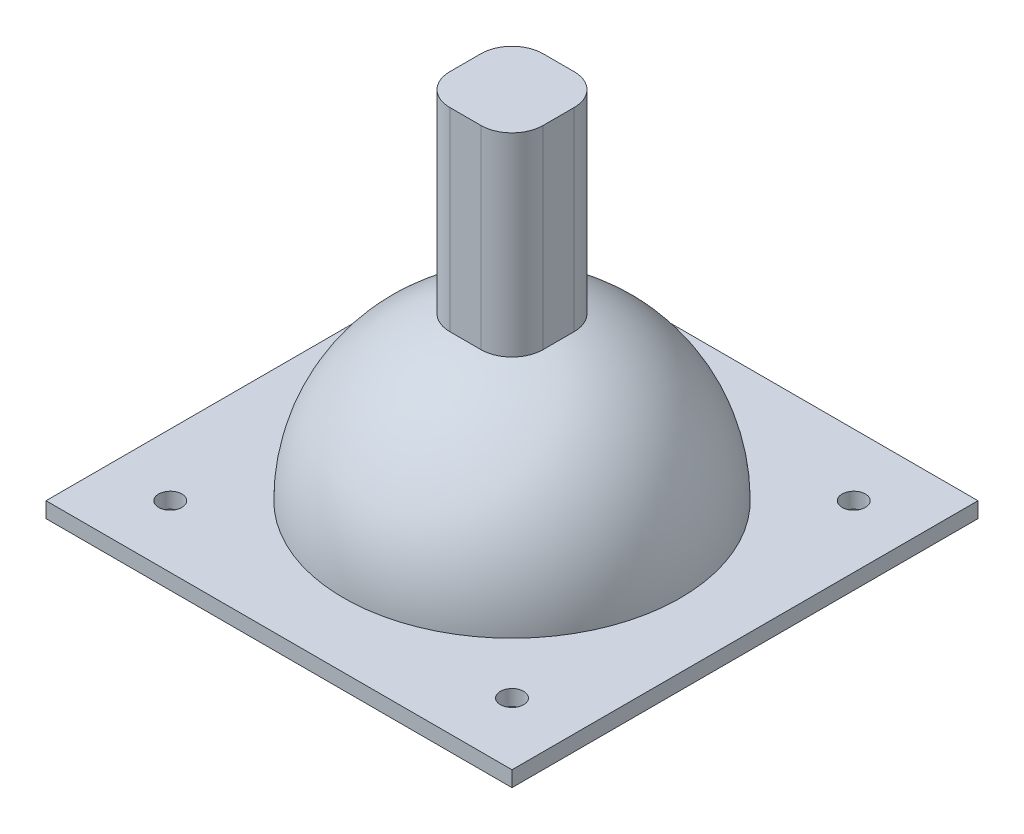
ISO-10303-21;
HEADER;
FILE_DESCRIPTION(('STEP AP214'),'2;1');
FILE_NAME('part.step','',(''),(''),'','','');
FILE_SCHEMA(('AUTOMOTIVE_DESIGN { 1 0 10303 214 1 1 1 1 }'));
ENDSEC;
DATA;
#1=APPLICATION_CONTEXT('core data for automotive mechanical design processes');
#2=APPLICATION_PROTOCOL_DEFINITION('international standard','automotive_design',2000,#1);
#3=PRODUCT_CONTEXT('',#1,'mechanical');
#4=PRODUCT('Part','Part','',(#3));
#5=PRODUCT_RELATED_PRODUCT_CATEGORY('part','',(#4));
#6=PRODUCT_DEFINITION_FORMATION('','',#4);
#7=PRODUCT_DEFINITION_CONTEXT('part definition',#1,'design');
#8=PRODUCT_DEFINITION('design','',#6,#7);
#9=PRODUCT_DEFINITION_SHAPE('','',#8);
#10=(LENGTH_UNIT() NAMED_UNIT(*) SI_UNIT(.MILLI.,.METRE.));
#11=(NAMED_UNIT(*) PLANE_ANGLE_UNIT() SI_UNIT($,.RADIAN.));
#12=(NAMED_UNIT(*) SI_UNIT($,.STERADIAN.) SOLID_ANGLE_UNIT());
#13=UNCERTAINTY_MEASURE_WITH_UNIT(LENGTH_MEASURE(1.E-05),#10,'distance_accuracy_value','');
#14=(GEOMETRIC_REPRESENTATION_CONTEXT(3) GLOBAL_UNCERTAINTY_ASSIGNED_CONTEXT((#13)) GLOBAL_UNIT_ASSIGNED_CONTEXT((#10,
#11,#12)) REPRESENTATION_CONTEXT('',''));
#15=CARTESIAN_POINT('',(0.,0.,0.));
#16=DIRECTION('',(0.,0.,1.));
#17=DIRECTION('',(1.,0.,0.));
#18=AXIS2_PLACEMENT_3D('',#15,#16,#17);
#19=CARTESIAN_POINT('',(0.,-26.4719078530888,0.));
#20=DIRECTION('',(0.,-1.,0.));
#21=DIRECTION('',(0.,0.,-1.));
#22=AXIS2_PLACEMENT_3D('',#19,#20,#21);
#23=PLANE('',#22);
#24=CARTESIAN_POINT('',(0.,-26.4719078530888,0.));
#25=DIRECTION('',(0.,-1.,0.));
#26=DIRECTION('',(0.,0.,-1.));
#27=AXIS2_PLACEMENT_3D('',#24,#25,#26);
#28=CIRCLE('',#27,24.892);
#29=CARTESIAN_POINT('',(0.,-26.4719078530888,-24.892));
#30=VERTEX_POINT('',#29);
#31=EDGE_CURVE('E336',#30,#30,#28,.F.);
#32=ORIENTED_EDGE('',*,*,#31,.F.);
#33=EDGE_LOOP('',(#32));
#34=FACE_BOUND('',#33,.T.);
#35=CARTESIAN_POINT('',(0.,-26.4719078530888,0.));
#36=DIRECTION('',(0.,1.,0.));
#37=DIRECTION('',(0.,0.,1.));
#38=AXIS2_PLACEMENT_3D('',#35,#36,#37);
#39=CIRCLE('',#38,25.0068020899419);
#40=CARTESIAN_POINT('',(0.,-26.4719078530888,25.0068020899419));
#41=VERTEX_POINT('',#40);
#42=EDGE_CURVE('E165',#41,#41,#39,.T.);
#43=ORIENTED_EDGE('',*,*,#42,.T.);
#44=EDGE_LOOP('',(#43));
#45=FACE_BOUND('',#44,.T.);
#46=ADVANCED_FACE('F33',(#34,#45),#23,.F.);
#47=CARTESIAN_POINT('',(0.,-26.4719078530888,0.));
#48=DIRECTION('',(0.,1.,0.));
#49=DIRECTION('',(0.,0.,1.));
#50=AXIS2_PLACEMENT_3D('',#47,#48,#49);
#51=SPHERICAL_SURFACE('',#50,25.0068020899419);
#52=ORIENTED_EDGE('',*,*,#42,.F.);
#53=EDGE_LOOP('',(#52));
#54=FACE_BOUND('',#53,.T.);
#55=ADVANCED_FACE('F292',(#54),#51,.F.);
#56=CARTESIAN_POINT('',(0.,43.9333001360933,0.));
#57=DIRECTION('',(0.,-1.,0.));
#58=DIRECTION('',(0.,0.,-1.));
#59=AXIS2_PLACEMENT_3D('',#56,#57,#58);
#60=CYLINDRICAL_SURFACE('',#59,24.892);
#61=ORIENTED_EDGE('',*,*,#31,.T.);
#62=EDGE_LOOP('',(#61));
#63=FACE_BOUND('',#62,.T.);
#64=CARTESIAN_POINT('',(0.,-29.0119078530888,0.));
#65=DIRECTION('',(0.,-1.,0.));
#66=DIRECTION('',(0.,0.,-1.));
#67=AXIS2_PLACEMENT_3D('',#64,#65,#66);
#68=CIRCLE('',#67,24.892);
#69=CARTESIAN_POINT('',(0.,-29.0119078530888,-24.892));
#70=VERTEX_POINT('',#69);
#71=EDGE_CURVE('E341',#70,#70,#68,.T.);
#72=ORIENTED_EDGE('',*,*,#71,.T.);
#73=EDGE_LOOP('',(#72));
#74=FACE_BOUND('',#73,.T.);
#75=ADVANCED_FACE('F299',(#63,#74),#60,.F.);
#76=CARTESIAN_POINT('',(0.,0.,0.));
#77=DIRECTION('',(0.,1.,0.));
#78=DIRECTION('',(0.,0.,1.));
#79=AXIS2_PLACEMENT_3D('',#76,#77,#78);
#80=PLANE('',#79);
#81=CARTESIAN_POINT('',(0.,0.,0.));
#82=DIRECTION('',(0.,1.,0.));
#83=DIRECTION('',(0.,0.,1.));
#84=AXIS2_PLACEMENT_3D('',#81,#82,#83);
#85=CIRCLE('',#84,7.62);
#86=CARTESIAN_POINT('',(0.,0.,7.62));
#87=VERTEX_POINT('',#86);
#88=CARTESIAN_POINT('',(-7.62,0.,0.));
#89=VERTEX_POINT('',#88);
#90=EDGE_CURVE('E11',#87,#89,#85,.F.);
#91=ORIENTED_EDGE('',*,*,#90,.F.);
#92=DIRECTION('',(1.,0.,0.));
#93=VECTOR('',#92,1.);
#94=CARTESIAN_POINT('',(7.62,0.,7.62));
#95=LINE('',#94,#93);
#96=CARTESIAN_POINT('',(-2.53999999999999,0.,7.62));
#97=VERTEX_POINT('',#96);
#98=EDGE_CURVE('E192',#97,#87,#95,.T.);
#99=ORIENTED_EDGE('',*,*,#98,.F.);
#100=CARTESIAN_POINT('',(-2.54,0.,2.54));
#101=DIRECTION('',(0.,1.,0.));
#102=DIRECTION('',(0.,0.,1.));
#103=AXIS2_PLACEMENT_3D('',#100,#101,#102);
#104=CIRCLE('',#103,5.08);
#105=CARTESIAN_POINT('',(-7.62,0.,2.54));
#106=VERTEX_POINT('',#105);
#107=EDGE_CURVE('E211',#97,#106,#104,.F.);
#108=ORIENTED_EDGE('',*,*,#107,.T.);
#109=DIRECTION('',(0.,0.,1.));
#110=VECTOR('',#109,1.);
#111=CARTESIAN_POINT('',(-7.62,0.,7.62));
#112=LINE('',#111,#110);
#113=EDGE_CURVE('E173',#89,#106,#112,.T.);
#114=ORIENTED_EDGE('',*,*,#113,.F.);
#115=EDGE_LOOP('',(#91,#99,#108,#114));
#116=FACE_BOUND('',#115,.T.);
#117=ADVANCED_FACE('F250',(#116),#80,.F.);
#118=CARTESIAN_POINT('',(0.,0.,-7.62));
#119=VERTEX_POINT('',#118);
#120=EDGE_CURVE('E42',#89,#119,#85,.F.);
#121=ORIENTED_EDGE('',*,*,#120,.F.);
#122=CARTESIAN_POINT('',(-7.62,0.,-2.53999999999999));
#123=VERTEX_POINT('',#122);
#124=EDGE_CURVE('E188',#123,#89,#112,.T.);
#125=ORIENTED_EDGE('',*,*,#124,.F.);
#126=CARTESIAN_POINT('',(-2.54,0.,-2.54));
#127=DIRECTION('',(0.,1.,0.));
#128=DIRECTION('',(0.,0.,1.));
#129=AXIS2_PLACEMENT_3D('',#126,#127,#128);
#130=CIRCLE('',#129,5.08);
#131=CARTESIAN_POINT('',(-2.54,0.,-7.62));
#132=VERTEX_POINT('',#131);
#133=EDGE_CURVE('E214',#123,#132,#130,.F.);
#134=ORIENTED_EDGE('',*,*,#133,.T.);
#135=DIRECTION('',(-1.,0.,0.));
#136=VECTOR('',#135,1.);
#137=CARTESIAN_POINT('',(7.62,0.,-7.62));
#138=LINE('',#137,#136);
#139=EDGE_CURVE('E198',#119,#132,#138,.T.);
#140=ORIENTED_EDGE('',*,*,#139,.F.);
#141=EDGE_LOOP('',(#121,#125,#134,#140));
#142=FACE_BOUND('',#141,.T.);
#143=ADVANCED_FACE('F248',(#142),#80,.F.);
#144=CARTESIAN_POINT('',(7.62,0.,0.));
#145=VERTEX_POINT('',#144);
#146=EDGE_CURVE('E55',#119,#145,#85,.F.);
#147=ORIENTED_EDGE('',*,*,#146,.F.);
#148=CARTESIAN_POINT('',(2.54,0.,-7.62));
#149=VERTEX_POINT('',#148);
#150=EDGE_CURVE('E178',#149,#119,#138,.T.);
#151=ORIENTED_EDGE('',*,*,#150,.F.);
#152=CARTESIAN_POINT('',(2.54,0.,-2.54));
#153=DIRECTION('',(0.,1.,0.));
#154=DIRECTION('',(0.,0.,1.));
#155=AXIS2_PLACEMENT_3D('',#152,#153,#154);
#156=CIRCLE('',#155,5.08);
#157=CARTESIAN_POINT('',(7.62,0.,-2.54));
#158=VERTEX_POINT('',#157);
#159=EDGE_CURVE('E205',#149,#158,#156,.F.);
#160=ORIENTED_EDGE('',*,*,#159,.T.);
#161=DIRECTION('',(0.,0.,-1.));
#162=VECTOR('',#161,1.);
#163=CARTESIAN_POINT('',(7.62,0.,7.62));
#164=LINE('',#163,#162);
#165=EDGE_CURVE('E194',#145,#158,#164,.T.);
#166=ORIENTED_EDGE('',*,*,#165,.F.);
#167=EDGE_LOOP('',(#147,#151,#160,#166));
#168=FACE_BOUND('',#167,.T.);
#169=ADVANCED_FACE('F270',(#168),#80,.F.);
#170=CARTESIAN_POINT('',(-7.62,31.75,7.62));
#171=DIRECTION('',(1.,0.,0.));
#172=DIRECTION('',(0.,0.,-1.));
#173=AXIS2_PLACEMENT_3D('',#170,#171,#172);
#174=PLANE('',#173);
#175=DIRECTION('',(0.,0.,1.));
#176=VECTOR('',#175,1.);
#177=CARTESIAN_POINT('',(-7.62,31.75,7.62));
#178=LINE('',#177,#176);
#179=CARTESIAN_POINT('',(-7.62,31.75,-2.53999999999999));
#180=VERTEX_POINT('',#179);
#181=CARTESIAN_POINT('',(-7.62,31.75,2.54));
#182=VERTEX_POINT('',#181);
#183=EDGE_CURVE('E174',#180,#182,#178,.T.);
#184=ORIENTED_EDGE('',*,*,#183,.F.);
#185=DIRECTION('',(0.,-1.,0.));
#186=VECTOR('',#185,1.);
#187=CARTESIAN_POINT('',(-7.62,31.75,-2.54));
#188=LINE('',#187,#186);
#189=EDGE_CURVE('E202',#180,#123,#188,.T.);
#190=ORIENTED_EDGE('',*,*,#189,.T.);
#191=ORIENTED_EDGE('',*,*,#124,.T.);
#192=ORIENTED_EDGE('',*,*,#113,.T.);
#193=DIRECTION('',(0.,-1.,0.));
#194=VECTOR('',#193,1.);
#195=CARTESIAN_POINT('',(-7.62,31.75,2.54));
#196=LINE('',#195,#194);
#197=EDGE_CURVE('E187',#106,#182,#196,.F.);
#198=ORIENTED_EDGE('',*,*,#197,.T.);
#199=EDGE_LOOP('',(#184,#190,#191,#192,#198));
#200=FACE_BOUND('',#199,.T.);
#201=ADVANCED_FACE('F255',(#200),#174,.F.);
#202=CARTESIAN_POINT('',(7.62,31.75,7.62));
#203=DIRECTION('',(0.,0.,-1.));
#204=DIRECTION('',(-1.,0.,0.));
#205=AXIS2_PLACEMENT_3D('',#202,#203,#204);
#206=PLANE('',#205);
#207=DIRECTION('',(1.,0.,0.));
#208=VECTOR('',#207,1.);
#209=CARTESIAN_POINT('',(7.62,31.75,7.62));
#210=LINE('',#209,#208);
#211=CARTESIAN_POINT('',(-2.53999999999999,31.75,7.62));
#212=VERTEX_POINT('',#211);
#213=CARTESIAN_POINT('',(2.54,31.75,7.62));
#214=VERTEX_POINT('',#213);
#215=EDGE_CURVE('E177',#212,#214,#210,.T.);
#216=ORIENTED_EDGE('',*,*,#215,.F.);
#217=DIRECTION('',(0.,-1.,0.));
#218=VECTOR('',#217,1.);
#219=CARTESIAN_POINT('',(-2.54,31.75,7.62));
#220=LINE('',#219,#218);
#221=EDGE_CURVE('E232',#212,#97,#220,.T.);
#222=ORIENTED_EDGE('',*,*,#221,.T.);
#223=ORIENTED_EDGE('',*,*,#98,.T.);
#224=CARTESIAN_POINT('',(2.54,0.,7.62));
#225=VERTEX_POINT('',#224);
#226=EDGE_CURVE('E191',#87,#225,#95,.T.);
#227=ORIENTED_EDGE('',*,*,#226,.T.);
#228=DIRECTION('',(0.,-1.,0.));
#229=VECTOR('',#228,1.);
#230=CARTESIAN_POINT('',(2.54,31.75,7.62));
#231=LINE('',#230,#229);
#232=EDGE_CURVE('E230',#225,#214,#231,.F.);
#233=ORIENTED_EDGE('',*,*,#232,.T.);
#234=EDGE_LOOP('',(#216,#222,#223,#227,#233));
#235=FACE_BOUND('',#234,.T.);
#236=ADVANCED_FACE('F279',(#235),#206,.F.);
#237=CARTESIAN_POINT('',(7.62,31.75,7.62));
#238=DIRECTION('',(-1.,0.,0.));
#239=DIRECTION('',(0.,0.,1.));
#240=AXIS2_PLACEMENT_3D('',#237,#238,#239);
#241=PLANE('',#240);
#242=DIRECTION('',(0.,0.,-1.));
#243=VECTOR('',#242,1.);
#244=CARTESIAN_POINT('',(7.62,31.75,7.62));
#245=LINE('',#244,#243);
#246=CARTESIAN_POINT('',(7.62,31.75,2.54));
#247=VERTEX_POINT('',#246);
#248=CARTESIAN_POINT('',(7.62,31.75,-2.54));
#249=VERTEX_POINT('',#248);
#250=EDGE_CURVE('E181',#247,#249,#245,.T.);
#251=ORIENTED_EDGE('',*,*,#250,.F.);
#252=DIRECTION('',(0.,-1.,0.));
#253=VECTOR('',#252,1.);
#254=CARTESIAN_POINT('',(7.62,31.75,2.54));
#255=LINE('',#254,#253);
#256=CARTESIAN_POINT('',(7.62,0.,2.54));
#257=VERTEX_POINT('',#256);
#258=EDGE_CURVE('E236',#247,#257,#255,.T.);
#259=ORIENTED_EDGE('',*,*,#258,.T.);
#260=EDGE_CURVE('E195',#257,#145,#164,.T.);
#261=ORIENTED_EDGE('',*,*,#260,.T.);
#262=ORIENTED_EDGE('',*,*,#165,.T.);
#263=DIRECTION('',(0.,-1.,0.));
#264=VECTOR('',#263,1.);
#265=CARTESIAN_POINT('',(7.62,31.75,-2.54));
#266=LINE('',#265,#264);
#267=EDGE_CURVE('E235',#158,#249,#266,.F.);
#268=ORIENTED_EDGE('',*,*,#267,.T.);
#269=EDGE_LOOP('',(#251,#259,#261,#262,#268));
#270=FACE_BOUND('',#269,.T.);
#271=ADVANCED_FACE('F271',(#270),#241,.F.);
#272=CARTESIAN_POINT('',(7.62,31.75,-7.62));
#273=DIRECTION('',(0.,0.,1.));
#274=DIRECTION('',(1.,0.,0.));
#275=AXIS2_PLACEMENT_3D('',#272,#273,#274);
#276=PLANE('',#275);
#277=ORIENTED_EDGE('',*,*,#150,.T.);
#278=ORIENTED_EDGE('',*,*,#139,.T.);
#279=DIRECTION('',(0.,-1.,0.));
#280=VECTOR('',#279,1.);
#281=CARTESIAN_POINT('',(-2.54,31.75,-7.62));
#282=LINE('',#281,#280);
#283=CARTESIAN_POINT('',(-2.54,31.75,-7.62));
#284=VERTEX_POINT('',#283);
#285=EDGE_CURVE('E220',#132,#284,#282,.F.);
#286=ORIENTED_EDGE('',*,*,#285,.T.);
#287=DIRECTION('',(-1.,0.,0.));
#288=VECTOR('',#287,1.);
#289=CARTESIAN_POINT('',(7.62,31.75,-7.62));
#290=LINE('',#289,#288);
#291=CARTESIAN_POINT('',(2.54,31.75,-7.62));
#292=VERTEX_POINT('',#291);
#293=EDGE_CURVE('E184',#292,#284,#290,.T.);
#294=ORIENTED_EDGE('',*,*,#293,.F.);
#295=DIRECTION('',(0.,-1.,0.));
#296=VECTOR('',#295,1.);
#297=CARTESIAN_POINT('',(2.54,31.75,-7.62));
#298=LINE('',#297,#296);
#299=EDGE_CURVE('E217',#292,#149,#298,.T.);
#300=ORIENTED_EDGE('',*,*,#299,.T.);
#301=EDGE_LOOP('',(#277,#278,#286,#294,#300));
#302=FACE_BOUND('',#301,.T.);
#303=ADVANCED_FACE('F263',(#302),#276,.F.);
#304=CARTESIAN_POINT('',(0.,31.75,0.));
#305=DIRECTION('',(0.,1.,0.));
#306=DIRECTION('',(0.,0.,1.));
#307=AXIS2_PLACEMENT_3D('',#304,#305,#306);
#308=PLANE('',#307);
#309=ORIENTED_EDGE('',*,*,#293,.T.);
#310=CARTESIAN_POINT('',(-2.54,31.75,-2.54));
#311=DIRECTION('',(0.,1.,0.));
#312=DIRECTION('',(0.,0.,1.));
#313=AXIS2_PLACEMENT_3D('',#310,#311,#312);
#314=CIRCLE('',#313,5.08);
#315=EDGE_CURVE('E228',#284,#180,#314,.T.);
#316=ORIENTED_EDGE('',*,*,#315,.T.);
#317=ORIENTED_EDGE('',*,*,#183,.T.);
#318=CARTESIAN_POINT('',(-2.54,31.75,2.54));
#319=DIRECTION('',(0.,1.,0.));
#320=DIRECTION('',(0.,0.,1.));
#321=AXIS2_PLACEMENT_3D('',#318,#319,#320);
#322=CIRCLE('',#321,5.08);
#323=EDGE_CURVE('E226',#182,#212,#322,.T.);
#324=ORIENTED_EDGE('',*,*,#323,.T.);
#325=ORIENTED_EDGE('',*,*,#215,.T.);
#326=CARTESIAN_POINT('',(2.54,31.75,2.54));
#327=DIRECTION('',(0.,1.,0.));
#328=DIRECTION('',(0.,0.,1.));
#329=AXIS2_PLACEMENT_3D('',#326,#327,#328);
#330=CIRCLE('',#329,5.08);
#331=EDGE_CURVE('E224',#214,#247,#330,.T.);
#332=ORIENTED_EDGE('',*,*,#331,.T.);
#333=ORIENTED_EDGE('',*,*,#250,.T.);
#334=CARTESIAN_POINT('',(2.54,31.75,-2.54));
#335=DIRECTION('',(0.,1.,0.));
#336=DIRECTION('',(0.,0.,1.));
#337=AXIS2_PLACEMENT_3D('',#334,#335,#336);
#338=CIRCLE('',#337,5.08);
#339=EDGE_CURVE('E222',#249,#292,#338,.T.);
#340=ORIENTED_EDGE('',*,*,#339,.T.);
#341=EDGE_LOOP('',(#309,#316,#317,#324,#325,#332,#333,#340));
#342=FACE_BOUND('',#341,.T.);
#343=ADVANCED_FACE('F266',(#342),#308,.T.);
#344=EDGE_CURVE('E37',#145,#87,#85,.F.);
#345=ORIENTED_EDGE('',*,*,#344,.F.);
#346=ORIENTED_EDGE('',*,*,#260,.F.);
#347=CARTESIAN_POINT('',(2.54,0.,2.54));
#348=DIRECTION('',(0.,1.,0.));
#349=DIRECTION('',(0.,0.,1.));
#350=AXIS2_PLACEMENT_3D('',#347,#348,#349);
#351=CIRCLE('',#350,5.08);
#352=EDGE_CURVE('E208',#257,#225,#351,.F.);
#353=ORIENTED_EDGE('',*,*,#352,.T.);
#354=ORIENTED_EDGE('',*,*,#226,.F.);
#355=EDGE_LOOP('',(#345,#346,#353,#354));
#356=FACE_BOUND('',#355,.T.);
#357=ADVANCED_FACE('F272',(#356),#80,.F.);
#358=CARTESIAN_POINT('',(-2.54,31.75,-2.54));
#359=DIRECTION('',(0.,-1.,0.));
#360=DIRECTION('',(0.,0.,-1.));
#361=AXIS2_PLACEMENT_3D('',#358,#359,#360);
#362=CYLINDRICAL_SURFACE('',#361,5.08);
#363=ORIENTED_EDGE('',*,*,#315,.F.);
#364=ORIENTED_EDGE('',*,*,#285,.F.);
#365=ORIENTED_EDGE('',*,*,#133,.F.);
#366=ORIENTED_EDGE('',*,*,#189,.F.);
#367=EDGE_LOOP('',(#363,#364,#365,#366));
#368=FACE_BOUND('',#367,.T.);
#369=ADVANCED_FACE('F259',(#368),#362,.T.);
#370=CARTESIAN_POINT('',(-2.54,31.75,2.54));
#371=DIRECTION('',(0.,-1.,0.));
#372=DIRECTION('',(0.,0.,-1.));
#373=AXIS2_PLACEMENT_3D('',#370,#371,#372);
#374=CYLINDRICAL_SURFACE('',#373,5.08);
#375=ORIENTED_EDGE('',*,*,#323,.F.);
#376=ORIENTED_EDGE('',*,*,#197,.F.);
#377=ORIENTED_EDGE('',*,*,#107,.F.);
#378=ORIENTED_EDGE('',*,*,#221,.F.);
#379=EDGE_LOOP('',(#375,#376,#377,#378));
#380=FACE_BOUND('',#379,.T.);
#381=ADVANCED_FACE('F283',(#380),#374,.T.);
#382=CARTESIAN_POINT('',(2.54,31.75,2.54));
#383=DIRECTION('',(0.,-1.,0.));
#384=DIRECTION('',(0.,0.,-1.));
#385=AXIS2_PLACEMENT_3D('',#382,#383,#384);
#386=CYLINDRICAL_SURFACE('',#385,5.08);
#387=ORIENTED_EDGE('',*,*,#331,.F.);
#388=ORIENTED_EDGE('',*,*,#232,.F.);
#389=ORIENTED_EDGE('',*,*,#352,.F.);
#390=ORIENTED_EDGE('',*,*,#258,.F.);
#391=EDGE_LOOP('',(#387,#388,#389,#390));
#392=FACE_BOUND('',#391,.T.);
#393=ADVANCED_FACE('F276',(#392),#386,.T.);
#394=CARTESIAN_POINT('',(2.54,31.75,-2.54));
#395=DIRECTION('',(0.,-1.,0.));
#396=DIRECTION('',(0.,0.,-1.));
#397=AXIS2_PLACEMENT_3D('',#394,#395,#396);
#398=CYLINDRICAL_SURFACE('',#397,5.08);
#399=ORIENTED_EDGE('',*,*,#339,.F.);
#400=ORIENTED_EDGE('',*,*,#267,.F.);
#401=ORIENTED_EDGE('',*,*,#159,.F.);
#402=ORIENTED_EDGE('',*,*,#299,.F.);
#403=EDGE_LOOP('',(#399,#400,#401,#402));
#404=FACE_BOUND('',#403,.T.);
#405=ADVANCED_FACE('F35',(#404),#398,.T.);
#406=CARTESIAN_POINT('',(0.,-26.4719078530888,0.));
#407=DIRECTION('',(0.,1.,0.));
#408=DIRECTION('',(0.,0.,-1.));
#409=AXIS2_PLACEMENT_3D('',#406,#407,#408);
#410=SPHERICAL_SURFACE('',#409,27.5468020899419);
#411=CARTESIAN_POINT('',(0.,-26.4719078530888,0.));
#412=DIRECTION('',(0.,-1.,0.));
#413=DIRECTION('',(0.,0.,-1.));
#414=AXIS2_PLACEMENT_3D('',#411,#412,#413);
#415=CIRCLE('',#414,27.5468020899419);
#416=CARTESIAN_POINT('',(0.,-26.4719078530888,-27.5468020899419));
#417=VERTEX_POINT('',#416);
#418=EDGE_CURVE('E162',#417,#417,#415,.T.);
#419=ORIENTED_EDGE('',*,*,#418,.F.);
#420=EDGE_LOOP('',(#419));
#421=FACE_BOUND('',#420,.T.);
#422=ORIENTED_EDGE('',*,*,#344,.T.);
#423=ORIENTED_EDGE('',*,*,#90,.T.);
#424=ORIENTED_EDGE('',*,*,#120,.T.);
#425=ORIENTED_EDGE('',*,*,#146,.T.);
#426=EDGE_LOOP('',(#422,#423,#424,#425));
#427=FACE_BOUND('',#426,.T.);
#428=ADVANCED_FACE('F243',(#421,#427),#410,.T.);
#429=CARTESIAN_POINT('',(-27.94,-26.4719078530888,27.94));
#430=DIRECTION('',(0.,1.,0.));
#431=DIRECTION('',(0.,0.,1.));
#432=AXIS2_PLACEMENT_3D('',#429,#430,#431);
#433=CIRCLE('',#432,1.905);
#434=CARTESIAN_POINT('',(-27.94,-26.4719078530888,29.845));
#435=VERTEX_POINT('',#434);
#436=EDGE_CURVE('E318',#435,#435,#433,.T.);
#437=ORIENTED_EDGE('',*,*,#436,.F.);
#438=EDGE_LOOP('',(#437));
#439=FACE_BOUND('',#438,.T.);
#440=CARTESIAN_POINT('',(27.94,-26.4719078530888,-27.94));
#441=DIRECTION('',(0.,1.,0.));
#442=DIRECTION('',(0.,0.,1.));
#443=AXIS2_PLACEMENT_3D('',#440,#441,#442);
#444=CIRCLE('',#443,1.905);
#445=CARTESIAN_POINT('',(27.94,-26.4719078530888,-26.035));
#446=VERTEX_POINT('',#445);
#447=EDGE_CURVE('E322',#446,#446,#444,.T.);
#448=ORIENTED_EDGE('',*,*,#447,.F.);
#449=EDGE_LOOP('',(#448));
#450=FACE_BOUND('',#449,.T.);
#451=CARTESIAN_POINT('',(27.94,-26.4719078530888,27.94));
#452=DIRECTION('',(0.,1.,0.));
#453=DIRECTION('',(0.,0.,1.));
#454=AXIS2_PLACEMENT_3D('',#451,#452,#453);
#455=CIRCLE('',#454,1.905);
#456=CARTESIAN_POINT('',(27.94,-26.4719078530888,29.845));
#457=VERTEX_POINT('',#456);
#458=EDGE_CURVE('E326',#457,#457,#455,.T.);
#459=ORIENTED_EDGE('',*,*,#458,.F.);
#460=EDGE_LOOP('',(#459));
#461=FACE_BOUND('',#460,.T.);
#462=CARTESIAN_POINT('',(-27.94,-26.4719078530888,-27.94));
#463=DIRECTION('',(0.,1.,0.));
#464=DIRECTION('',(0.,0.,1.));
#465=AXIS2_PLACEMENT_3D('',#462,#463,#464);
#466=CIRCLE('',#465,1.905);
#467=CARTESIAN_POINT('',(-27.94,-26.4719078530888,-26.035));
#468=VERTEX_POINT('',#467);
#469=EDGE_CURVE('E330',#468,#468,#466,.T.);
#470=ORIENTED_EDGE('',*,*,#469,.F.);
#471=EDGE_LOOP('',(#470));
#472=FACE_BOUND('',#471,.T.);
#473=DIRECTION('',(0.,0.,-1.));
#474=VECTOR('',#473,1.);
#475=CARTESIAN_POINT('',(-38.1,-26.4719078530888,-38.1));
#476=LINE('',#475,#474);
#477=CARTESIAN_POINT('',(-38.1,-26.4719078530888,38.1));
#478=VERTEX_POINT('',#477);
#479=CARTESIAN_POINT('',(-38.1,-26.4719078530888,-38.1));
#480=VERTEX_POINT('',#479);
#481=EDGE_CURVE('E161',#478,#480,#476,.T.);
#482=ORIENTED_EDGE('',*,*,#481,.F.);
#483=DIRECTION('',(-1.,0.,0.));
#484=VECTOR('',#483,1.);
#485=CARTESIAN_POINT('',(38.1,-26.4719078530888,38.1));
#486=LINE('',#485,#484);
#487=CARTESIAN_POINT('',(38.1,-26.4719078530888,38.1));
#488=VERTEX_POINT('',#487);
#489=EDGE_CURVE('E157',#488,#478,#486,.T.);
#490=ORIENTED_EDGE('',*,*,#489,.F.);
#491=DIRECTION('',(0.,0.,1.));
#492=VECTOR('',#491,1.);
#493=CARTESIAN_POINT('',(38.1,-26.4719078530888,-38.1));
#494=LINE('',#493,#492);
#495=CARTESIAN_POINT('',(38.1,-26.4719078530888,-38.1));
#496=VERTEX_POINT('',#495);
#497=EDGE_CURVE('E338',#496,#488,#494,.T.);
#498=ORIENTED_EDGE('',*,*,#497,.F.);
#499=DIRECTION('',(1.,0.,0.));
#500=VECTOR('',#499,1.);
#501=CARTESIAN_POINT('',(38.1,-26.4719078530888,-38.1));
#502=LINE('',#501,#500);
#503=EDGE_CURVE('E335',#480,#496,#502,.T.);
#504=ORIENTED_EDGE('',*,*,#503,.F.);
#505=EDGE_LOOP('',(#482,#490,#498,#504));
#506=FACE_BOUND('',#505,.T.);
#507=ORIENTED_EDGE('',*,*,#418,.T.);
#508=EDGE_LOOP('',(#507));
#509=FACE_BOUND('',#508,.T.);
#510=ADVANCED_FACE('F295',(#439,#450,#461,#472,#506,#509),#23,.F.);
#511=CARTESIAN_POINT('',(-38.1,-29.0119078530888,-38.1));
#512=DIRECTION('',(1.,0.,0.));
#513=DIRECTION('',(0.,0.,-1.));
#514=AXIS2_PLACEMENT_3D('',#511,#512,#513);
#515=PLANE('',#514);
#516=ORIENTED_EDGE('',*,*,#481,.T.);
#517=DIRECTION('',(0.,1.,0.));
#518=VECTOR('',#517,1.);
#519=CARTESIAN_POINT('',(-38.1,-29.0119078530888,-38.1));
#520=LINE('',#519,#518);
#521=CARTESIAN_POINT('',(-38.1,-29.0119078530888,-38.1));
#522=VERTEX_POINT('',#521);
#523=EDGE_CURVE('E141',#522,#480,#520,.T.);
#524=ORIENTED_EDGE('',*,*,#523,.F.);
#525=DIRECTION('',(0.,0.,-1.));
#526=VECTOR('',#525,1.);
#527=CARTESIAN_POINT('',(-38.1,-29.0119078530888,-38.1));
#528=LINE('',#527,#526);
#529=CARTESIAN_POINT('',(-38.1,-29.0119078530888,38.1));
#530=VERTEX_POINT('',#529);
#531=EDGE_CURVE('E148',#530,#522,#528,.T.);
#532=ORIENTED_EDGE('',*,*,#531,.F.);
#533=DIRECTION('',(0.,1.,0.));
#534=VECTOR('',#533,1.);
#535=CARTESIAN_POINT('',(-38.1,-29.0119078530888,38.1));
#536=LINE('',#535,#534);
#537=EDGE_CURVE('E348',#530,#478,#536,.T.);
#538=ORIENTED_EDGE('',*,*,#537,.T.);
#539=EDGE_LOOP('',(#516,#524,#532,#538));
#540=FACE_BOUND('',#539,.T.);
#541=ADVANCED_FACE('F159',(#540),#515,.F.);
#542=CARTESIAN_POINT('',(38.1,-29.0119078530888,-38.1));
#543=DIRECTION('',(0.,0.,1.));
#544=DIRECTION('',(1.,0.,0.));
#545=AXIS2_PLACEMENT_3D('',#542,#543,#544);
#546=PLANE('',#545);
#547=ORIENTED_EDGE('',*,*,#503,.T.);
#548=DIRECTION('',(0.,1.,0.));
#549=VECTOR('',#548,1.);
#550=CARTESIAN_POINT('',(38.1,-29.0119078530888,-38.1));
#551=LINE('',#550,#549);
#552=CARTESIAN_POINT('',(38.1,-29.0119078530888,-38.1));
#553=VERTEX_POINT('',#552);
#554=EDGE_CURVE('E144',#553,#496,#551,.T.);
#555=ORIENTED_EDGE('',*,*,#554,.F.);
#556=DIRECTION('',(1.,0.,0.));
#557=VECTOR('',#556,1.);
#558=CARTESIAN_POINT('',(38.1,-29.0119078530888,-38.1));
#559=LINE('',#558,#557);
#560=EDGE_CURVE('E137',#522,#553,#559,.T.);
#561=ORIENTED_EDGE('',*,*,#560,.F.);
#562=ORIENTED_EDGE('',*,*,#523,.T.);
#563=EDGE_LOOP('',(#547,#555,#561,#562));
#564=FACE_BOUND('',#563,.T.);
#565=ADVANCED_FACE('F139',(#564),#546,.F.);
#566=CARTESIAN_POINT('',(38.1,-29.0119078530888,-38.1));
#567=DIRECTION('',(-1.,0.,0.));
#568=DIRECTION('',(0.,0.,1.));
#569=AXIS2_PLACEMENT_3D('',#566,#567,#568);
#570=PLANE('',#569);
#571=ORIENTED_EDGE('',*,*,#497,.T.);
#572=DIRECTION('',(0.,1.,0.));
#573=VECTOR('',#572,1.);
#574=CARTESIAN_POINT('',(38.1,-29.0119078530888,38.1));
#575=LINE('',#574,#573);
#576=CARTESIAN_POINT('',(38.1,-29.0119078530888,38.1));
#577=VERTEX_POINT('',#576);
#578=EDGE_CURVE('E167',#577,#488,#575,.T.);
#579=ORIENTED_EDGE('',*,*,#578,.F.);
#580=DIRECTION('',(0.,0.,1.));
#581=VECTOR('',#580,1.);
#582=CARTESIAN_POINT('',(38.1,-29.0119078530888,-38.1));
#583=LINE('',#582,#581);
#584=EDGE_CURVE('E147',#553,#577,#583,.T.);
#585=ORIENTED_EDGE('',*,*,#584,.F.);
#586=ORIENTED_EDGE('',*,*,#554,.T.);
#587=EDGE_LOOP('',(#571,#579,#585,#586));
#588=FACE_BOUND('',#587,.T.);
#589=ADVANCED_FACE('F354',(#588),#570,.F.);
#590=CARTESIAN_POINT('',(38.1,-29.0119078530888,38.1));
#591=DIRECTION('',(0.,0.,-1.));
#592=DIRECTION('',(-1.,0.,0.));
#593=AXIS2_PLACEMENT_3D('',#590,#591,#592);
#594=PLANE('',#593);
#595=ORIENTED_EDGE('',*,*,#489,.T.);
#596=ORIENTED_EDGE('',*,*,#537,.F.);
#597=DIRECTION('',(-1.,0.,0.));
#598=VECTOR('',#597,1.);
#599=CARTESIAN_POINT('',(38.1,-29.0119078530888,38.1));
#600=LINE('',#599,#598);
#601=EDGE_CURVE('E153',#577,#530,#600,.T.);
#602=ORIENTED_EDGE('',*,*,#601,.F.);
#603=ORIENTED_EDGE('',*,*,#578,.T.);
#604=EDGE_LOOP('',(#595,#596,#602,#603));
#605=FACE_BOUND('',#604,.T.);
#606=ADVANCED_FACE('F352',(#605),#594,.F.);
#607=CARTESIAN_POINT('',(0.,-29.0119078530888,0.));
#608=DIRECTION('',(0.,-1.,0.));
#609=DIRECTION('',(0.,0.,-1.));
#610=AXIS2_PLACEMENT_3D('',#607,#608,#609);
#611=PLANE('',#610);
#612=CARTESIAN_POINT('',(-27.94,-29.0119078530888,27.94));
#613=DIRECTION('',(0.,1.,0.));
#614=DIRECTION('',(0.,0.,1.));
#615=AXIS2_PLACEMENT_3D('',#612,#613,#614);
#616=CIRCLE('',#615,1.905);
#617=CARTESIAN_POINT('',(-27.94,-29.0119078530888,29.845));
#618=VERTEX_POINT('',#617);
#619=EDGE_CURVE('E360',#618,#618,#616,.T.);
#620=ORIENTED_EDGE('',*,*,#619,.T.);
#621=EDGE_LOOP('',(#620));
#622=FACE_BOUND('',#621,.T.);
#623=CARTESIAN_POINT('',(27.94,-29.0119078530888,-27.94));
#624=DIRECTION('',(0.,1.,0.));
#625=DIRECTION('',(0.,0.,1.));
#626=AXIS2_PLACEMENT_3D('',#623,#624,#625);
#627=CIRCLE('',#626,1.905);
#628=CARTESIAN_POINT('',(27.94,-29.0119078530888,-26.035));
#629=VERTEX_POINT('',#628);
#630=EDGE_CURVE('E368',#629,#629,#627,.T.);
#631=ORIENTED_EDGE('',*,*,#630,.T.);
#632=EDGE_LOOP('',(#631));
#633=FACE_BOUND('',#632,.T.);
#634=CARTESIAN_POINT('',(27.94,-29.0119078530888,27.94));
#635=DIRECTION('',(0.,1.,0.));
#636=DIRECTION('',(0.,0.,1.));
#637=AXIS2_PLACEMENT_3D('',#634,#635,#636);
#638=CIRCLE('',#637,1.905);
#639=CARTESIAN_POINT('',(27.94,-29.0119078530888,29.845));
#640=VERTEX_POINT('',#639);
#641=EDGE_CURVE('E364',#640,#640,#638,.T.);
#642=ORIENTED_EDGE('',*,*,#641,.T.);
#643=EDGE_LOOP('',(#642));
#644=FACE_BOUND('',#643,.T.);
#645=CARTESIAN_POINT('',(-27.94,-29.0119078530888,-27.94));
#646=DIRECTION('',(0.,1.,0.));
#647=DIRECTION('',(0.,0.,1.));
#648=AXIS2_PLACEMENT_3D('',#645,#646,#647);
#649=CIRCLE('',#648,1.905);
#650=CARTESIAN_POINT('',(-27.94,-29.0119078530888,-26.035));
#651=VERTEX_POINT('',#650);
#652=EDGE_CURVE('E358',#651,#651,#649,.T.);
#653=ORIENTED_EDGE('',*,*,#652,.T.);
#654=EDGE_LOOP('',(#653));
#655=FACE_BOUND('',#654,.T.);
#656=ORIENTED_EDGE('',*,*,#71,.F.);
#657=EDGE_LOOP('',(#656));
#658=FACE_BOUND('',#657,.T.);
#659=ORIENTED_EDGE('',*,*,#531,.T.);
#660=ORIENTED_EDGE('',*,*,#560,.T.);
#661=ORIENTED_EDGE('',*,*,#584,.T.);
#662=ORIENTED_EDGE('',*,*,#601,.T.);
#663=EDGE_LOOP('',(#659,#660,#661,#662));
#664=FACE_BOUND('',#663,.T.);
#665=ADVANCED_FACE('F151',(#622,#633,#644,#655,#658,#664),#611,.T.);
#666=CARTESIAN_POINT('',(-27.94,-29.0119078530888,-27.94));
#667=DIRECTION('',(0.,1.,0.));
#668=DIRECTION('',(0.,0.,1.));
#669=AXIS2_PLACEMENT_3D('',#666,#667,#668);
#670=CYLINDRICAL_SURFACE('',#669,1.905);
#671=ORIENTED_EDGE('',*,*,#652,.F.);
#672=EDGE_LOOP('',(#671));
#673=FACE_BOUND('',#672,.T.);
#674=ORIENTED_EDGE('',*,*,#469,.T.);
#675=EDGE_LOOP('',(#674));
#676=FACE_BOUND('',#675,.T.);
#677=ADVANCED_FACE('F391',(#673,#676),#670,.F.);
#678=CARTESIAN_POINT('',(27.94,-29.0119078530888,27.94));
#679=DIRECTION('',(0.,1.,0.));
#680=DIRECTION('',(0.,0.,1.));
#681=AXIS2_PLACEMENT_3D('',#678,#679,#680);
#682=CYLINDRICAL_SURFACE('',#681,1.905);
#683=ORIENTED_EDGE('',*,*,#641,.F.);
#684=EDGE_LOOP('',(#683));
#685=FACE_BOUND('',#684,.T.);
#686=ORIENTED_EDGE('',*,*,#458,.T.);
#687=EDGE_LOOP('',(#686));
#688=FACE_BOUND('',#687,.T.);
#689=ADVANCED_FACE('F385',(#685,#688),#682,.F.);
#690=CARTESIAN_POINT('',(27.94,-29.0119078530888,-27.94));
#691=DIRECTION('',(0.,1.,0.));
#692=DIRECTION('',(0.,0.,1.));
#693=AXIS2_PLACEMENT_3D('',#690,#691,#692);
#694=CYLINDRICAL_SURFACE('',#693,1.905);
#695=ORIENTED_EDGE('',*,*,#630,.F.);
#696=EDGE_LOOP('',(#695));
#697=FACE_BOUND('',#696,.T.);
#698=ORIENTED_EDGE('',*,*,#447,.T.);
#699=EDGE_LOOP('',(#698));
#700=FACE_BOUND('',#699,.T.);
#701=ADVANCED_FACE('F380',(#697,#700),#694,.F.);
#702=CARTESIAN_POINT('',(-27.94,-29.0119078530888,27.94));
#703=DIRECTION('',(0.,1.,0.));
#704=DIRECTION('',(0.,0.,1.));
#705=AXIS2_PLACEMENT_3D('',#702,#703,#704);
#706=CYLINDRICAL_SURFACE('',#705,1.905);
#707=ORIENTED_EDGE('',*,*,#619,.F.);
#708=EDGE_LOOP('',(#707));
#709=FACE_BOUND('',#708,.T.);
#710=ORIENTED_EDGE('',*,*,#436,.T.);
#711=EDGE_LOOP('',(#710));
#712=FACE_BOUND('',#711,.T.);
#713=ADVANCED_FACE('F377',(#709,#712),#706,.F.);
#714=CLOSED_SHELL('',(#46,#55,#75,#117,#143,#169,#201,#236,#271,#303,#343,#357,#369,#381,#393,
#405,#428,#510,#541,#565,#589,#606,#665,#677,#689,#701,#713));
#715=MANIFOLD_SOLID_BREP('B2',#714);
#716=ADVANCED_BREP_SHAPE_REPRESENTATION('',(#18,#715),#14);
#717=SHAPE_DEFINITION_REPRESENTATION(#9,#716);
ENDSEC;
END-ISO-10303-21;
